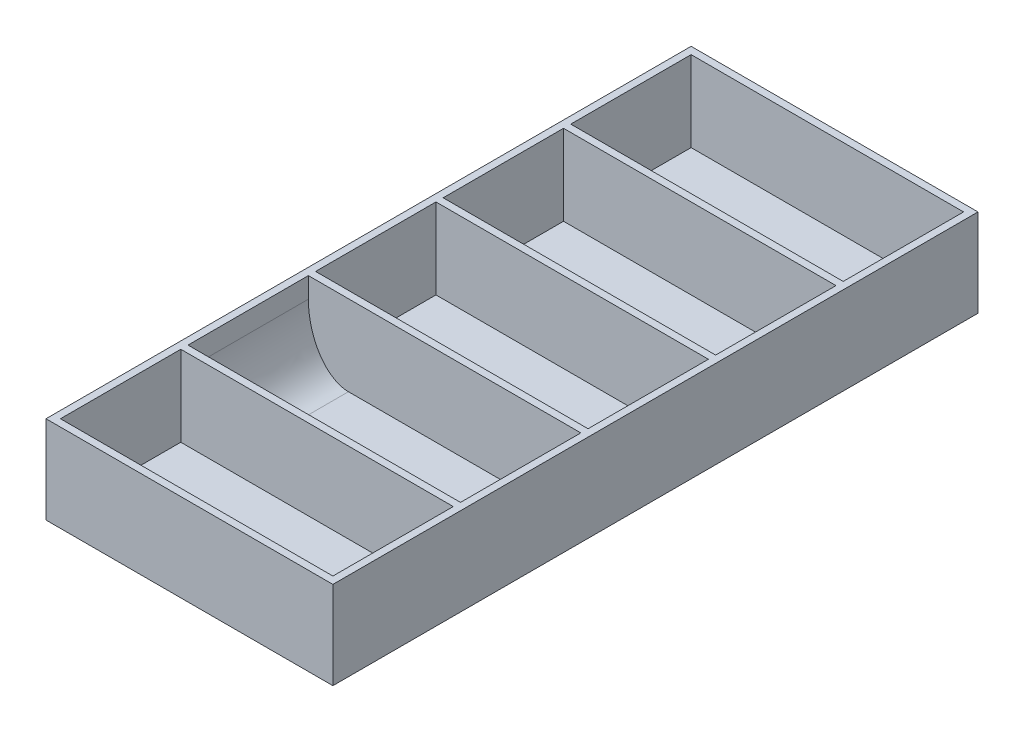
ISO-10303-21;
HEADER;
FILE_DESCRIPTION(('STEP AP214'),'2;1');
FILE_NAME('part.step','',(''),(''),'','','');
FILE_SCHEMA(('AUTOMOTIVE_DESIGN { 1 0 10303 214 1 1 1 1 }'));
ENDSEC;
DATA;
#1=APPLICATION_CONTEXT('core data for automotive mechanical design processes');
#2=APPLICATION_PROTOCOL_DEFINITION('international standard','automotive_design',2000,#1);
#3=PRODUCT_CONTEXT('',#1,'mechanical');
#4=PRODUCT('Part','Part','',(#3));
#5=PRODUCT_RELATED_PRODUCT_CATEGORY('part','',(#4));
#6=PRODUCT_DEFINITION_FORMATION('','',#4);
#7=PRODUCT_DEFINITION_CONTEXT('part definition',#1,'design');
#8=PRODUCT_DEFINITION('design','',#6,#7);
#9=PRODUCT_DEFINITION_SHAPE('','',#8);
#10=(LENGTH_UNIT() NAMED_UNIT(*) SI_UNIT(.MILLI.,.METRE.));
#11=(NAMED_UNIT(*) PLANE_ANGLE_UNIT() SI_UNIT($,.RADIAN.));
#12=(NAMED_UNIT(*) SI_UNIT($,.STERADIAN.) SOLID_ANGLE_UNIT());
#13=UNCERTAINTY_MEASURE_WITH_UNIT(LENGTH_MEASURE(1.E-05),#10,'distance_accuracy_value','');
#14=(GEOMETRIC_REPRESENTATION_CONTEXT(3) GLOBAL_UNCERTAINTY_ASSIGNED_CONTEXT((#13)) GLOBAL_UNIT_ASSIGNED_CONTEXT((#10,
#11,#12)) REPRESENTATION_CONTEXT('',''));
#15=CARTESIAN_POINT('',(0.,0.,0.));
#16=DIRECTION('',(0.,0.,1.));
#17=DIRECTION('',(1.,0.,0.));
#18=AXIS2_PLACEMENT_3D('',#15,#16,#17);
#19=CARTESIAN_POINT('',(69.8,15.,-66.684));
#20=CARTESIAN_POINT('',(69.8,15.,-54.6679999999999));
#21=CARTESIAN_POINT('',(69.8,15.,-42.6520000000001));
#22=CARTESIAN_POINT('',(69.8,15.,-30.636));
#23=CARTESIAN_POINT('',(69.8,0.,-66.684));
#24=CARTESIAN_POINT('',(69.8,0.,-54.6679999999999));
#25=CARTESIAN_POINT('',(69.8,0.,-42.6520000000001));
#26=CARTESIAN_POINT('',(69.8,0.,-30.636));
#27=CARTESIAN_POINT('',(59.8,0.,-66.684));
#28=CARTESIAN_POINT('',(59.8,0.,-54.6679999999999));
#29=CARTESIAN_POINT('',(59.8,0.,-42.6520000000001));
#30=CARTESIAN_POINT('',(59.8,0.,-30.636));
#31=(BOUNDED_SURFACE() B_SPLINE_SURFACE(2,3,((#19,#20,#21,#22),(#23,#24,#25,#26),(#27,#28,#29,
#30)),.UNSPECIFIED.,.F.,.F.,.F.) B_SPLINE_SURFACE_WITH_KNOTS((3,3),(4,4),(0.,1.),(-0.066684,
-0.030636),.UNSPECIFIED.) GEOMETRIC_REPRESENTATION_ITEM() RATIONAL_B_SPLINE_SURFACE(((1.,1.,1.,
1.),(0.707106781186548,0.707106781186548,0.707106781186548,0.707106781186548),(1.,1.,1.,1.))) REPRESENTATION_ITEM('') SURFACE());
#32=CARTESIAN_POINT('',(59.8,0.,-66.684));
#33=CARTESIAN_POINT('',(59.8,0.,-54.6679999999999));
#34=CARTESIAN_POINT('',(59.8,0.,-42.6520000000001));
#35=CARTESIAN_POINT('',(59.8,0.,-30.636));
#36=(BOUNDED_CURVE() B_SPLINE_CURVE(3,(#32,#33,#34,#35),.UNSPECIFIED.,.F.,
.F.) B_SPLINE_CURVE_WITH_KNOTS((4,4),(-0.066684,-0.030636),
.UNSPECIFIED.) CURVE() GEOMETRIC_REPRESENTATION_ITEM() RATIONAL_B_SPLINE_CURVE((1.,1.,1.,1.)) REPRESENTATION_ITEM(''));
#37=CARTESIAN_POINT('',(59.8,0.,-33.64));
#38=VERTEX_POINT('',#37);
#39=CARTESIAN_POINT('',(59.8,0.,-63.68));
#40=VERTEX_POINT('',#39);
#41=EDGE_CURVE('E761',#38,#40,#36,.F.);
#42=CARTESIAN_POINT('',(59.8,0.,-33.64));
#43=CARTESIAN_POINT('',(69.8,0.,-33.64));
#44=CARTESIAN_POINT('',(69.8,15.,-33.64));
#45=(BOUNDED_CURVE() B_SPLINE_CURVE(2,(#42,#43,#44),.UNSPECIFIED.,.F.,
.F.) B_SPLINE_CURVE_WITH_KNOTS((3,3),(0.,1.),
.UNSPECIFIED.) CURVE() GEOMETRIC_REPRESENTATION_ITEM() RATIONAL_B_SPLINE_CURVE((1.,
0.707106781186548,1.)) REPRESENTATION_ITEM(''));
#46=CARTESIAN_POINT('',(69.8,15.,-33.64));
#47=VERTEX_POINT('',#46);
#48=EDGE_CURVE('E60',#47,#38,#45,.F.);
#49=CARTESIAN_POINT('',(69.8,15.,-30.636));
#50=CARTESIAN_POINT('',(69.8,15.,-42.6520000000001));
#51=CARTESIAN_POINT('',(69.8,15.,-54.6679999999999));
#52=CARTESIAN_POINT('',(69.8,15.,-66.684));
#53=(BOUNDED_CURVE() B_SPLINE_CURVE(3,(#49,#50,#51,#52),.UNSPECIFIED.,.F.,
.F.) B_SPLINE_CURVE_WITH_KNOTS((4,4),(-0.066684,-0.030636),
.UNSPECIFIED.) CURVE() GEOMETRIC_REPRESENTATION_ITEM() RATIONAL_B_SPLINE_CURVE((1.,1.,1.,1.)) REPRESENTATION_ITEM(''));
#54=CARTESIAN_POINT('',(69.8,15.,-63.68));
#55=VERTEX_POINT('',#54);
#56=EDGE_CURVE('E803',#55,#47,#53,.F.);
#57=CARTESIAN_POINT('',(69.8,15.,-63.68));
#58=CARTESIAN_POINT('',(69.8,0.,-63.68));
#59=CARTESIAN_POINT('',(59.8,0.,-63.68));
#60=(BOUNDED_CURVE() B_SPLINE_CURVE(2,(#57,#58,#59),.UNSPECIFIED.,.F.,
.F.) B_SPLINE_CURVE_WITH_KNOTS((3,3),(0.,1.),
.UNSPECIFIED.) CURVE() GEOMETRIC_REPRESENTATION_ITEM() RATIONAL_B_SPLINE_CURVE((1.,
0.707106781186548,1.)) REPRESENTATION_ITEM(''));
#61=EDGE_CURVE('E12',#40,#55,#60,.F.);
#62=ORIENTED_EDGE('',*,*,#41,.F.);
#63=ORIENTED_EDGE('',*,*,#48,.F.);
#64=ORIENTED_EDGE('',*,*,#56,.F.);
#65=ORIENTED_EDGE('',*,*,#61,.F.);
#66=EDGE_LOOP('',(#62,#63,#64,#65));
#67=FACE_BOUND('',#66,.T.);
#68=ADVANCED_FACE('F46',(#67),#31,.T.);
#69=CARTESIAN_POINT('',(11.8,0.,-66.684));
#70=CARTESIAN_POINT('',(11.8,0.,-54.668));
#71=CARTESIAN_POINT('',(11.8,0.,-42.652));
#72=CARTESIAN_POINT('',(11.8,0.,-30.636));
#73=CARTESIAN_POINT('',(1.80000000000001,0.,-66.684));
#74=CARTESIAN_POINT('',(1.79999999996875,0.,-54.668));
#75=CARTESIAN_POINT('',(1.79999999996875,0.,-42.652));
#76=CARTESIAN_POINT('',(1.80000000000002,0.,-30.636));
#77=CARTESIAN_POINT('',(1.80000000000001,15.,-66.684));
#78=CARTESIAN_POINT('',(1.80000000000001,15.,-54.668));
#79=CARTESIAN_POINT('',(1.80000000000001,15.,-42.652));
#80=CARTESIAN_POINT('',(1.80000000000002,15.,-30.636));
#81=(BOUNDED_SURFACE() B_SPLINE_SURFACE(2,3,((#69,#70,#71,#72),(#73,#74,#75,#76),(#77,#78,#79,
#80)),.UNSPECIFIED.,.F.,.F.,.F.) B_SPLINE_SURFACE_WITH_KNOTS((3,3),(4,4),(0.,1.),(-0.003004,
0.033044),.UNSPECIFIED.) GEOMETRIC_REPRESENTATION_ITEM() RATIONAL_B_SPLINE_SURFACE(((1.,1.,1.,
1.),(0.707106781186548,0.707106781186548,0.707106781186548,0.707106781186548),(1.,1.,1.,1.))) REPRESENTATION_ITEM('') SURFACE());
#82=CARTESIAN_POINT('',(1.80000000000001,15.,-66.684));
#83=CARTESIAN_POINT('',(1.80000000000001,15.,-54.668));
#84=CARTESIAN_POINT('',(1.80000000000001,15.,-42.652));
#85=CARTESIAN_POINT('',(1.80000000000002,15.,-30.636));
#86=(BOUNDED_CURVE() B_SPLINE_CURVE(3,(#82,#83,#84,#85),.UNSPECIFIED.,.F.,
.F.) B_SPLINE_CURVE_WITH_KNOTS((4,4),(-0.003004,0.033044),
.UNSPECIFIED.) CURVE() GEOMETRIC_REPRESENTATION_ITEM() RATIONAL_B_SPLINE_CURVE((1.,1.,1.,1.)) REPRESENTATION_ITEM(''));
#87=CARTESIAN_POINT('',(1.80000000000001,15.,-33.64));
#88=VERTEX_POINT('',#87);
#89=CARTESIAN_POINT('',(1.80000000000001,15.,-63.68));
#90=VERTEX_POINT('',#89);
#91=EDGE_CURVE('E498',#88,#90,#86,.F.);
#92=CARTESIAN_POINT('',(1.80000000000002,15.,-33.64));
#93=CARTESIAN_POINT('',(1.79999999999285,0.,-33.64));
#94=CARTESIAN_POINT('',(11.8,0.,-33.64));
#95=(BOUNDED_CURVE() B_SPLINE_CURVE(2,(#92,#93,#94),.UNSPECIFIED.,.F.,
.F.) B_SPLINE_CURVE_WITH_KNOTS((3,3),(0.,1.),
.UNSPECIFIED.) CURVE() GEOMETRIC_REPRESENTATION_ITEM() RATIONAL_B_SPLINE_CURVE((1.,
0.707106781186548,1.)) REPRESENTATION_ITEM(''));
#96=CARTESIAN_POINT('',(11.8,0.,-33.64));
#97=VERTEX_POINT('',#96);
#98=EDGE_CURVE('E436',#97,#88,#95,.F.);
#99=CARTESIAN_POINT('',(11.8,0.,-30.636));
#100=CARTESIAN_POINT('',(11.8,0.,-42.652));
#101=CARTESIAN_POINT('',(11.8,0.,-54.668));
#102=CARTESIAN_POINT('',(11.8,0.,-66.684));
#103=(BOUNDED_CURVE() B_SPLINE_CURVE(3,(#99,#100,#101,#102),.UNSPECIFIED.,.F.,
.F.) B_SPLINE_CURVE_WITH_KNOTS((4,4),(-0.003004,0.033044),
.UNSPECIFIED.) CURVE() GEOMETRIC_REPRESENTATION_ITEM() RATIONAL_B_SPLINE_CURVE((1.,1.,1.,1.)) REPRESENTATION_ITEM(''));
#104=CARTESIAN_POINT('',(11.8,0.,-63.68));
#105=VERTEX_POINT('',#104);
#106=EDGE_CURVE('E800',#105,#97,#103,.F.);
#107=CARTESIAN_POINT('',(11.8,0.,-63.68));
#108=CARTESIAN_POINT('',(1.79999999999285,0.,-63.68));
#109=CARTESIAN_POINT('',(1.80000000000001,15.,-63.68));
#110=(BOUNDED_CURVE() B_SPLINE_CURVE(2,(#107,#108,#109),.UNSPECIFIED.,.F.,
.F.) B_SPLINE_CURVE_WITH_KNOTS((3,3),(0.,1.),
.UNSPECIFIED.) CURVE() GEOMETRIC_REPRESENTATION_ITEM() RATIONAL_B_SPLINE_CURVE((1.,
0.707106781186548,1.)) REPRESENTATION_ITEM(''));
#111=EDGE_CURVE('E805',#90,#105,#110,.F.);
#112=ORIENTED_EDGE('',*,*,#91,.F.);
#113=ORIENTED_EDGE('',*,*,#98,.F.);
#114=ORIENTED_EDGE('',*,*,#106,.F.);
#115=ORIENTED_EDGE('',*,*,#111,.F.);
#116=EDGE_LOOP('',(#112,#113,#114,#115));
#117=FACE_BOUND('',#116,.T.);
#118=ADVANCED_FACE('F506',(#117),#81,.T.);
#119=CARTESIAN_POINT('',(54.8,0.,-62.476));
#120=CARTESIAN_POINT('',(54.8,0.,-74.492));
#121=CARTESIAN_POINT('',(54.8,0.,-86.508));
#122=CARTESIAN_POINT('',(54.8,0.,-98.524));
#123=CARTESIAN_POINT('',(69.8,0.,-62.476));
#124=CARTESIAN_POINT('',(69.8,-6.25229035210936E-11,-74.492));
#125=CARTESIAN_POINT('',(69.8,-6.25229035228294E-11,-86.508));
#126=CARTESIAN_POINT('',(69.8,0.,-98.524));
#127=CARTESIAN_POINT('',(69.8,20.,-62.476));
#128=CARTESIAN_POINT('',(69.8,20.,-74.492));
#129=CARTESIAN_POINT('',(69.8,20.,-86.508));
#130=CARTESIAN_POINT('',(69.8,20.,-98.524));
#131=(BOUNDED_SURFACE() B_SPLINE_SURFACE(2,3,((#119,#120,#121,#122),(#123,#124,#125,#126),(#127,
#128,#129,#130)),.UNSPECIFIED.,.F.,.F.,.F.) B_SPLINE_SURFACE_WITH_KNOTS((3,3),(4,4),(0.,1.),
(-0.033044,0.003004),
.UNSPECIFIED.) GEOMETRIC_REPRESENTATION_ITEM() RATIONAL_B_SPLINE_SURFACE(((1.,1.,1.,1.),
(0.707106781186548,0.707106781186548,0.707106781186548,0.707106781186548),(1.,1.,1.,1.))) REPRESENTATION_ITEM('') SURFACE());
#132=CARTESIAN_POINT('',(69.8,20.,-62.476));
#133=CARTESIAN_POINT('',(69.8,20.,-74.492));
#134=CARTESIAN_POINT('',(69.8,20.,-86.508));
#135=CARTESIAN_POINT('',(69.8,20.,-98.524));
#136=(BOUNDED_CURVE() B_SPLINE_CURVE(3,(#132,#133,#134,#135),.UNSPECIFIED.,.F.,
.F.) B_SPLINE_CURVE_WITH_KNOTS((4,4),(-0.033044,0.003004),
.UNSPECIFIED.) CURVE() GEOMETRIC_REPRESENTATION_ITEM() RATIONAL_B_SPLINE_CURVE((1.,1.,1.,1.)) REPRESENTATION_ITEM(''));
#137=CARTESIAN_POINT('',(69.8,20.,-95.52));
#138=VERTEX_POINT('',#137);
#139=CARTESIAN_POINT('',(69.8,20.,-65.48));
#140=VERTEX_POINT('',#139);
#141=EDGE_CURVE('E680',#138,#140,#136,.F.);
#142=CARTESIAN_POINT('',(69.8,20.,-95.52));
#143=CARTESIAN_POINT('',(69.8,-1.43201422945389E-11,-95.52));
#144=CARTESIAN_POINT('',(54.8,0.,-95.52));
#145=(BOUNDED_CURVE() B_SPLINE_CURVE(2,(#142,#143,#144),.UNSPECIFIED.,.F.,
.F.) B_SPLINE_CURVE_WITH_KNOTS((3,3),(0.,1.),
.UNSPECIFIED.) CURVE() GEOMETRIC_REPRESENTATION_ITEM() RATIONAL_B_SPLINE_CURVE((1.,
0.707106781186548,1.)) REPRESENTATION_ITEM(''));
#146=CARTESIAN_POINT('',(54.8,0.,-95.52));
#147=VERTEX_POINT('',#146);
#148=EDGE_CURVE('E813',#147,#138,#145,.F.);
#149=CARTESIAN_POINT('',(54.8,0.,-98.524));
#150=CARTESIAN_POINT('',(54.8,0.,-86.508));
#151=CARTESIAN_POINT('',(54.8,0.,-74.492));
#152=CARTESIAN_POINT('',(54.8,0.,-62.476));
#153=(BOUNDED_CURVE() B_SPLINE_CURVE(3,(#149,#150,#151,#152),.UNSPECIFIED.,.F.,
.F.) B_SPLINE_CURVE_WITH_KNOTS((4,4),(-0.033044,0.003004),
.UNSPECIFIED.) CURVE() GEOMETRIC_REPRESENTATION_ITEM() RATIONAL_B_SPLINE_CURVE((1.,1.,1.,1.)) REPRESENTATION_ITEM(''));
#154=CARTESIAN_POINT('',(54.8,0.,-65.48));
#155=VERTEX_POINT('',#154);
#156=EDGE_CURVE('E390',#155,#147,#153,.F.);
#157=CARTESIAN_POINT('',(54.8,0.,-65.48));
#158=CARTESIAN_POINT('',(69.8,-1.43201422942072E-11,-65.48));
#159=CARTESIAN_POINT('',(69.8,20.,-65.48));
#160=(BOUNDED_CURVE() B_SPLINE_CURVE(2,(#157,#158,#159),.UNSPECIFIED.,.F.,
.F.) B_SPLINE_CURVE_WITH_KNOTS((3,3),(0.,1.),
.UNSPECIFIED.) CURVE() GEOMETRIC_REPRESENTATION_ITEM() RATIONAL_B_SPLINE_CURVE((1.,
0.707106781186548,1.)) REPRESENTATION_ITEM(''));
#161=EDGE_CURVE('E811',#140,#155,#160,.F.);
#162=ORIENTED_EDGE('',*,*,#141,.F.);
#163=ORIENTED_EDGE('',*,*,#148,.F.);
#164=ORIENTED_EDGE('',*,*,#156,.F.);
#165=ORIENTED_EDGE('',*,*,#161,.F.);
#166=EDGE_LOOP('',(#162,#163,#164,#165));
#167=FACE_BOUND('',#166,.T.);
#168=ADVANCED_FACE('F520',(#167),#131,.T.);
#169=CARTESIAN_POINT('',(54.8,15.,-97.32));
#170=DIRECTION('',(0.,0.,-1.));
#171=DIRECTION('',(-1.,0.,0.));
#172=AXIS2_PLACEMENT_3D('',#169,#170,#171);
#173=CYLINDRICAL_SURFACE('',#172,15.);
#174=DIRECTION('',(0.,0.,1.));
#175=VECTOR('',#174,1.);
#176=CARTESIAN_POINT('',(69.8,15.,-97.32));
#177=LINE('',#176,#175);
#178=CARTESIAN_POINT('',(69.8,15.,-127.36));
#179=VERTEX_POINT('',#178);
#180=CARTESIAN_POINT('',(69.8,15.,-97.32));
#181=VERTEX_POINT('',#180);
#182=EDGE_CURVE('E660',#179,#181,#177,.T.);
#183=ORIENTED_EDGE('',*,*,#182,.F.);
#184=CARTESIAN_POINT('',(54.8,15.,-127.36));
#185=DIRECTION('',(0.,0.,1.));
#186=DIRECTION('',(1.,0.,0.));
#187=AXIS2_PLACEMENT_3D('',#184,#185,#186);
#188=CIRCLE('',#187,15.);
#189=CARTESIAN_POINT('',(54.8,0.,-127.36));
#190=VERTEX_POINT('',#189);
#191=EDGE_CURVE('E674',#190,#179,#188,.T.);
#192=ORIENTED_EDGE('',*,*,#191,.F.);
#193=DIRECTION('',(0.,0.,1.));
#194=VECTOR('',#193,1.);
#195=CARTESIAN_POINT('',(54.8,0.,-97.32));
#196=LINE('',#195,#194);
#197=CARTESIAN_POINT('',(54.8,0.,-97.32));
#198=VERTEX_POINT('',#197);
#199=EDGE_CURVE('E669',#198,#190,#196,.F.);
#200=ORIENTED_EDGE('',*,*,#199,.F.);
#201=CARTESIAN_POINT('',(54.8,15.,-97.32));
#202=DIRECTION('',(0.,0.,-1.));
#203=DIRECTION('',(-1.,0.,0.));
#204=AXIS2_PLACEMENT_3D('',#201,#202,#203);
#205=CIRCLE('',#204,15.);
#206=EDGE_CURVE('E677',#181,#198,#205,.T.);
#207=ORIENTED_EDGE('',*,*,#206,.F.);
#208=EDGE_LOOP('',(#183,#192,#200,#207));
#209=FACE_BOUND('',#208,.T.);
#210=ADVANCED_FACE('F623',(#209),#173,.F.);
#211=CARTESIAN_POINT('',(59.8,0.,-126.156));
#212=CARTESIAN_POINT('',(59.8,0.,-138.172));
#213=CARTESIAN_POINT('',(59.8,0.,-150.188));
#214=CARTESIAN_POINT('',(59.8,0.,-162.204));
#215=CARTESIAN_POINT('',(69.8,0.,-126.156));
#216=CARTESIAN_POINT('',(69.8,0.,-138.172));
#217=CARTESIAN_POINT('',(69.8,0.,-150.188));
#218=CARTESIAN_POINT('',(69.8,0.,-162.204));
#219=CARTESIAN_POINT('',(69.8,15.,-126.156));
#220=CARTESIAN_POINT('',(69.8,15.,-138.172));
#221=CARTESIAN_POINT('',(69.8,15.,-150.188));
#222=CARTESIAN_POINT('',(69.8,15.,-162.204));
#223=(BOUNDED_SURFACE() B_SPLINE_SURFACE(2,3,((#211,#212,#213,#214),(#215,#216,#217,#218),(#219,
#220,#221,#222)),.UNSPECIFIED.,.F.,.F.,.F.) B_SPLINE_SURFACE_WITH_KNOTS((3,3),(4,4),(0.,1.),
(-0.003004,0.033044),
.UNSPECIFIED.) GEOMETRIC_REPRESENTATION_ITEM() RATIONAL_B_SPLINE_SURFACE(((1.,1.,1.,1.),
(0.707106781186548,0.707106781186548,0.707106781186548,0.707106781186548),(1.,1.,1.,1.))) REPRESENTATION_ITEM('') SURFACE());
#224=CARTESIAN_POINT('',(69.8,15.,-126.156));
#225=CARTESIAN_POINT('',(69.8,15.,-138.172));
#226=CARTESIAN_POINT('',(69.8,15.,-150.188));
#227=CARTESIAN_POINT('',(69.8,15.,-162.204));
#228=(BOUNDED_CURVE() B_SPLINE_CURVE(3,(#224,#225,#226,#227),.UNSPECIFIED.,.F.,
.F.) B_SPLINE_CURVE_WITH_KNOTS((4,4),(-0.003004,0.033044),
.UNSPECIFIED.) CURVE() GEOMETRIC_REPRESENTATION_ITEM() RATIONAL_B_SPLINE_CURVE((1.,1.,1.,1.)) REPRESENTATION_ITEM(''));
#229=CARTESIAN_POINT('',(69.8,15.,-159.2));
#230=VERTEX_POINT('',#229);
#231=CARTESIAN_POINT('',(69.8,15.,-129.16));
#232=VERTEX_POINT('',#231);
#233=EDGE_CURVE('E857',#230,#232,#228,.F.);
#234=CARTESIAN_POINT('',(69.8,15.,-159.2));
#235=CARTESIAN_POINT('',(69.8,0.,-159.2));
#236=CARTESIAN_POINT('',(59.8,0.,-159.2));
#237=(BOUNDED_CURVE() B_SPLINE_CURVE(2,(#234,#235,#236),.UNSPECIFIED.,.F.,
.F.) B_SPLINE_CURVE_WITH_KNOTS((3,3),(0.,1.),
.UNSPECIFIED.) CURVE() GEOMETRIC_REPRESENTATION_ITEM() RATIONAL_B_SPLINE_CURVE((1.,
0.707106781186548,1.)) REPRESENTATION_ITEM(''));
#238=CARTESIAN_POINT('',(59.8,0.,-159.2));
#239=VERTEX_POINT('',#238);
#240=EDGE_CURVE('E263',#239,#230,#237,.F.);
#241=CARTESIAN_POINT('',(59.8,0.,-162.204));
#242=CARTESIAN_POINT('',(59.8,0.,-150.188));
#243=CARTESIAN_POINT('',(59.8,0.,-138.172));
#244=CARTESIAN_POINT('',(59.8,0.,-126.156));
#245=(BOUNDED_CURVE() B_SPLINE_CURVE(3,(#241,#242,#243,#244),.UNSPECIFIED.,.F.,
.F.) B_SPLINE_CURVE_WITH_KNOTS((4,4),(-0.003004,0.033044),
.UNSPECIFIED.) CURVE() GEOMETRIC_REPRESENTATION_ITEM() RATIONAL_B_SPLINE_CURVE((1.,1.,1.,1.)) REPRESENTATION_ITEM(''));
#246=CARTESIAN_POINT('',(59.8,0.,-129.16));
#247=VERTEX_POINT('',#246);
#248=EDGE_CURVE('E854',#247,#239,#245,.F.);
#249=CARTESIAN_POINT('',(59.8,0.,-129.16));
#250=CARTESIAN_POINT('',(69.8,0.,-129.16));
#251=CARTESIAN_POINT('',(69.8,15.,-129.16));
#252=(BOUNDED_CURVE() B_SPLINE_CURVE(2,(#249,#250,#251),.UNSPECIFIED.,.F.,
.F.) B_SPLINE_CURVE_WITH_KNOTS((3,3),(0.,1.),
.UNSPECIFIED.) CURVE() GEOMETRIC_REPRESENTATION_ITEM() RATIONAL_B_SPLINE_CURVE((1.,
0.707106781186548,1.)) REPRESENTATION_ITEM(''));
#253=EDGE_CURVE('E670',#232,#247,#252,.F.);
#254=ORIENTED_EDGE('',*,*,#233,.F.);
#255=ORIENTED_EDGE('',*,*,#240,.F.);
#256=ORIENTED_EDGE('',*,*,#248,.F.);
#257=ORIENTED_EDGE('',*,*,#253,.F.);
#258=EDGE_LOOP('',(#254,#255,#256,#257));
#259=FACE_BOUND('',#258,.T.);
#260=ADVANCED_FACE('F609',(#259),#223,.T.);
#261=CARTESIAN_POINT('',(0.,-1.8,0.));
#262=DIRECTION('',(0.,0.,1.));
#263=DIRECTION('',(1.,0.,0.));
#264=AXIS2_PLACEMENT_3D('',#261,#262,#263);
#265=PLANE('',#264);
#266=DIRECTION('',(0.,1.,0.));
#267=VECTOR('',#266,1.);
#268=CARTESIAN_POINT('',(71.6,-1.8,0.));
#269=LINE('',#268,#267);
#270=CARTESIAN_POINT('',(71.6,-1.8,0.));
#271=VERTEX_POINT('',#270);
#272=CARTESIAN_POINT('',(71.6,20.1,0.));
#273=VERTEX_POINT('',#272);
#274=EDGE_CURVE('E309',#271,#273,#269,.T.);
#275=ORIENTED_EDGE('',*,*,#274,.T.);
#276=DIRECTION('',(1.,0.,0.));
#277=VECTOR('',#276,1.);
#278=CARTESIAN_POINT('',(0.,20.1,0.));
#279=LINE('',#278,#277);
#280=CARTESIAN_POINT('',(0.,20.1,0.));
#281=VERTEX_POINT('',#280);
#282=EDGE_CURVE('E906',#281,#273,#279,.T.);
#283=ORIENTED_EDGE('',*,*,#282,.F.);
#284=DIRECTION('',(0.,1.,0.));
#285=VECTOR('',#284,1.);
#286=CARTESIAN_POINT('',(0.,-1.8,0.));
#287=LINE('',#286,#285);
#288=CARTESIAN_POINT('',(0.,-1.8,0.));
#289=VERTEX_POINT('',#288);
#290=EDGE_CURVE('E860',#289,#281,#287,.T.);
#291=ORIENTED_EDGE('',*,*,#290,.F.);
#292=DIRECTION('',(1.,0.,0.));
#293=VECTOR('',#292,1.);
#294=CARTESIAN_POINT('',(0.,-1.8,0.));
#295=LINE('',#294,#293);
#296=EDGE_CURVE('E894',#289,#271,#295,.T.);
#297=ORIENTED_EDGE('',*,*,#296,.T.);
#298=EDGE_LOOP('',(#275,#283,#291,#297));
#299=FACE_BOUND('',#298,.T.);
#300=ADVANCED_FACE('F622',(#299),#265,.T.);
#301=CARTESIAN_POINT('',(0.,-1.8,0.));
#302=DIRECTION('',(1.,0.,0.));
#303=DIRECTION('',(0.,0.,-1.));
#304=AXIS2_PLACEMENT_3D('',#301,#302,#303);
#305=PLANE('',#304);
#306=ORIENTED_EDGE('',*,*,#290,.T.);
#307=DIRECTION('',(0.,0.,1.));
#308=VECTOR('',#307,1.);
#309=CARTESIAN_POINT('',(0.,20.1,0.));
#310=LINE('',#309,#308);
#311=CARTESIAN_POINT('',(0.,20.1,-161.));
#312=VERTEX_POINT('',#311);
#313=EDGE_CURVE('E909',#312,#281,#310,.T.);
#314=ORIENTED_EDGE('',*,*,#313,.F.);
#315=DIRECTION('',(0.,1.,0.));
#316=VECTOR('',#315,1.);
#317=CARTESIAN_POINT('',(0.,-1.8,-161.));
#318=LINE('',#317,#316);
#319=CARTESIAN_POINT('',(0.,-1.8,-161.));
#320=VERTEX_POINT('',#319);
#321=EDGE_CURVE('E862',#320,#312,#318,.T.);
#322=ORIENTED_EDGE('',*,*,#321,.F.);
#323=DIRECTION('',(0.,0.,-1.));
#324=VECTOR('',#323,1.);
#325=CARTESIAN_POINT('',(0.,-1.8,0.));
#326=LINE('',#325,#324);
#327=EDGE_CURVE('E872',#289,#320,#326,.T.);
#328=ORIENTED_EDGE('',*,*,#327,.F.);
#329=EDGE_LOOP('',(#306,#314,#322,#328));
#330=FACE_BOUND('',#329,.T.);
#331=ADVANCED_FACE('F413',(#330),#305,.F.);
#332=CARTESIAN_POINT('',(0.,-1.8,-161.));
#333=DIRECTION('',(0.,0.,1.));
#334=DIRECTION('',(1.,0.,0.));
#335=AXIS2_PLACEMENT_3D('',#332,#333,#334);
#336=PLANE('',#335);
#337=ORIENTED_EDGE('',*,*,#321,.T.);
#338=DIRECTION('',(-1.,0.,0.));
#339=VECTOR('',#338,1.);
#340=CARTESIAN_POINT('',(0.,20.1,-161.));
#341=LINE('',#340,#339);
#342=CARTESIAN_POINT('',(71.6,20.1,-161.));
#343=VERTEX_POINT('',#342);
#344=EDGE_CURVE('E899',#343,#312,#341,.T.);
#345=ORIENTED_EDGE('',*,*,#344,.F.);
#346=DIRECTION('',(0.,1.,0.));
#347=VECTOR('',#346,1.);
#348=CARTESIAN_POINT('',(71.6,-1.8,-161.));
#349=LINE('',#348,#347);
#350=CARTESIAN_POINT('',(71.6,-1.8,-161.));
#351=VERTEX_POINT('',#350);
#352=EDGE_CURVE('E869',#351,#343,#349,.T.);
#353=ORIENTED_EDGE('',*,*,#352,.F.);
#354=DIRECTION('',(1.,0.,0.));
#355=VECTOR('',#354,1.);
#356=CARTESIAN_POINT('',(0.,-1.8,-161.));
#357=LINE('',#356,#355);
#358=EDGE_CURVE('E885',#320,#351,#357,.T.);
#359=ORIENTED_EDGE('',*,*,#358,.F.);
#360=EDGE_LOOP('',(#337,#345,#353,#359));
#361=FACE_BOUND('',#360,.T.);
#362=ADVANCED_FACE('F1001',(#361),#336,.F.);
#363=CARTESIAN_POINT('',(71.6,-1.8,0.));
#364=DIRECTION('',(1.,0.,0.));
#365=DIRECTION('',(0.,0.,-1.));
#366=AXIS2_PLACEMENT_3D('',#363,#364,#365);
#367=PLANE('',#366);
#368=ORIENTED_EDGE('',*,*,#352,.T.);
#369=DIRECTION('',(0.,0.,-1.));
#370=VECTOR('',#369,1.);
#371=CARTESIAN_POINT('',(71.6,20.1,0.));
#372=LINE('',#371,#370);
#373=EDGE_CURVE('E903',#273,#343,#372,.T.);
#374=ORIENTED_EDGE('',*,*,#373,.F.);
#375=ORIENTED_EDGE('',*,*,#274,.F.);
#376=DIRECTION('',(0.,0.,-1.));
#377=VECTOR('',#376,1.);
#378=CARTESIAN_POINT('',(71.6,-1.8,0.));
#379=LINE('',#378,#377);
#380=EDGE_CURVE('E890',#271,#351,#379,.T.);
#381=ORIENTED_EDGE('',*,*,#380,.T.);
#382=EDGE_LOOP('',(#368,#374,#375,#381));
#383=FACE_BOUND('',#382,.T.);
#384=ADVANCED_FACE('F1007',(#383),#367,.T.);
#385=CARTESIAN_POINT('',(0.,-1.8,0.));
#386=DIRECTION('',(0.,1.,0.));
#387=DIRECTION('',(0.,0.,1.));
#388=AXIS2_PLACEMENT_3D('',#385,#386,#387);
#389=PLANE('',#388);
#390=ORIENTED_EDGE('',*,*,#296,.F.);
#391=ORIENTED_EDGE('',*,*,#327,.T.);
#392=ORIENTED_EDGE('',*,*,#358,.T.);
#393=ORIENTED_EDGE('',*,*,#380,.F.);
#394=EDGE_LOOP('',(#390,#391,#392,#393));
#395=FACE_BOUND('',#394,.T.);
#396=ADVANCED_FACE('F411',(#395),#389,.F.);
#397=CARTESIAN_POINT('',(0.,20.1,0.));
#398=DIRECTION('',(0.,-1.,0.));
#399=DIRECTION('',(0.,0.,-1.));
#400=AXIS2_PLACEMENT_3D('',#397,#398,#399);
#401=PLANE('',#400);
#402=DIRECTION('',(0.,0.,-1.));
#403=VECTOR('',#402,1.);
#404=CARTESIAN_POINT('',(69.8,20.1,-97.32));
#405=LINE('',#404,#403);
#406=CARTESIAN_POINT('',(69.8,20.1,-97.32));
#407=VERTEX_POINT('',#406);
#408=CARTESIAN_POINT('',(69.8,20.1,-127.36));
#409=VERTEX_POINT('',#408);
#410=EDGE_CURVE('E314',#407,#409,#405,.T.);
#411=ORIENTED_EDGE('',*,*,#410,.F.);
#412=DIRECTION('',(1.,0.,0.));
#413=VECTOR('',#412,1.);
#414=CARTESIAN_POINT('',(69.8,20.1,-97.32));
#415=LINE('',#414,#413);
#416=CARTESIAN_POINT('',(1.8,20.1,-97.32));
#417=VERTEX_POINT('',#416);
#418=EDGE_CURVE('E325',#417,#407,#415,.T.);
#419=ORIENTED_EDGE('',*,*,#418,.F.);
#420=DIRECTION('',(0.,0.,1.));
#421=VECTOR('',#420,1.);
#422=CARTESIAN_POINT('',(1.8,20.1,-97.32));
#423=LINE('',#422,#421);
#424=CARTESIAN_POINT('',(1.8,20.1,-127.36));
#425=VERTEX_POINT('',#424);
#426=EDGE_CURVE('E321',#425,#417,#423,.T.);
#427=ORIENTED_EDGE('',*,*,#426,.F.);
#428=DIRECTION('',(-1.,0.,0.));
#429=VECTOR('',#428,1.);
#430=CARTESIAN_POINT('',(69.8,20.1,-127.36));
#431=LINE('',#430,#429);
#432=EDGE_CURVE('E317',#409,#425,#431,.T.);
#433=ORIENTED_EDGE('',*,*,#432,.F.);
#434=EDGE_LOOP('',(#411,#419,#427,#433));
#435=FACE_BOUND('',#434,.T.);
#436=DIRECTION('',(0.,0.,1.));
#437=VECTOR('',#436,1.);
#438=CARTESIAN_POINT('',(1.8,20.1,-31.84));
#439=LINE('',#438,#437);
#440=CARTESIAN_POINT('',(1.8,20.1,-31.84));
#441=VERTEX_POINT('',#440);
#442=CARTESIAN_POINT('',(1.80000000000001,20.1,-1.8));
#443=VERTEX_POINT('',#442);
#444=EDGE_CURVE('E696',#441,#443,#439,.T.);
#445=ORIENTED_EDGE('',*,*,#444,.F.);
#446=DIRECTION('',(-1.,0.,0.));
#447=VECTOR('',#446,1.);
#448=CARTESIAN_POINT('',(1.8,20.1,-31.84));
#449=LINE('',#448,#447);
#450=CARTESIAN_POINT('',(69.8,20.1,-31.84));
#451=VERTEX_POINT('',#450);
#452=EDGE_CURVE('E707',#451,#441,#449,.T.);
#453=ORIENTED_EDGE('',*,*,#452,.F.);
#454=DIRECTION('',(0.,0.,-1.));
#455=VECTOR('',#454,1.);
#456=CARTESIAN_POINT('',(69.8,20.1,-31.84));
#457=LINE('',#456,#455);
#458=CARTESIAN_POINT('',(69.8,20.1,-1.8));
#459=VERTEX_POINT('',#458);
#460=EDGE_CURVE('E703',#459,#451,#457,.T.);
#461=ORIENTED_EDGE('',*,*,#460,.F.);
#462=DIRECTION('',(1.,0.,0.));
#463=VECTOR('',#462,1.);
#464=CARTESIAN_POINT('',(1.80000000000001,20.1,-1.8));
#465=LINE('',#464,#463);
#466=EDGE_CURVE('E699',#443,#459,#465,.T.);
#467=ORIENTED_EDGE('',*,*,#466,.F.);
#468=EDGE_LOOP('',(#445,#453,#461,#467));
#469=FACE_BOUND('',#468,.T.);
#470=ORIENTED_EDGE('',*,*,#313,.T.);
#471=ORIENTED_EDGE('',*,*,#282,.T.);
#472=ORIENTED_EDGE('',*,*,#373,.T.);
#473=ORIENTED_EDGE('',*,*,#344,.T.);
#474=EDGE_LOOP('',(#470,#471,#472,#473));
#475=FACE_BOUND('',#474,.T.);
#476=DIRECTION('',(0.,0.,-1.));
#477=VECTOR('',#476,1.);
#478=CARTESIAN_POINT('',(69.8,20.1,-63.68));
#479=LINE('',#478,#477);
#480=CARTESIAN_POINT('',(69.8,20.1,-33.64));
#481=VERTEX_POINT('',#480);
#482=CARTESIAN_POINT('',(69.8,20.1,-63.68));
#483=VERTEX_POINT('',#482);
#484=EDGE_CURVE('E737',#481,#483,#479,.T.);
#485=ORIENTED_EDGE('',*,*,#484,.F.);
#486=DIRECTION('',(1.,0.,0.));
#487=VECTOR('',#486,1.);
#488=CARTESIAN_POINT('',(69.8,20.1,-33.64));
#489=LINE('',#488,#487);
#490=CARTESIAN_POINT('',(1.80000000000001,20.1,-33.64));
#491=VERTEX_POINT('',#490);
#492=EDGE_CURVE('E748',#491,#481,#489,.T.);
#493=ORIENTED_EDGE('',*,*,#492,.F.);
#494=DIRECTION('',(0.,0.,1.));
#495=VECTOR('',#494,1.);
#496=CARTESIAN_POINT('',(1.80000000000001,20.1,-63.68));
#497=LINE('',#496,#495);
#498=CARTESIAN_POINT('',(1.80000000000001,20.1,-63.68));
#499=VERTEX_POINT('',#498);
#500=EDGE_CURVE('E744',#499,#491,#497,.T.);
#501=ORIENTED_EDGE('',*,*,#500,.F.);
#502=DIRECTION('',(-1.,0.,0.));
#503=VECTOR('',#502,1.);
#504=CARTESIAN_POINT('',(69.8,20.1,-63.68));
#505=LINE('',#504,#503);
#506=EDGE_CURVE('E740',#483,#499,#505,.T.);
#507=ORIENTED_EDGE('',*,*,#506,.F.);
#508=EDGE_LOOP('',(#485,#493,#501,#507));
#509=FACE_BOUND('',#508,.T.);
#510=DIRECTION('',(0.,0.,1.));
#511=VECTOR('',#510,1.);
#512=CARTESIAN_POINT('',(1.79999999999999,20.1,-95.52));
#513=LINE('',#512,#511);
#514=CARTESIAN_POINT('',(1.79999999999999,20.1,-95.52));
#515=VERTEX_POINT('',#514);
#516=CARTESIAN_POINT('',(1.8,20.1,-65.48));
#517=VERTEX_POINT('',#516);
#518=EDGE_CURVE('E353',#515,#517,#513,.T.);
#519=ORIENTED_EDGE('',*,*,#518,.F.);
#520=DIRECTION('',(-1.,0.,0.));
#521=VECTOR('',#520,1.);
#522=CARTESIAN_POINT('',(1.79999999999999,20.1,-95.52));
#523=LINE('',#522,#521);
#524=CARTESIAN_POINT('',(69.8,20.1,-95.52));
#525=VERTEX_POINT('',#524);
#526=EDGE_CURVE('E364',#525,#515,#523,.T.);
#527=ORIENTED_EDGE('',*,*,#526,.F.);
#528=DIRECTION('',(0.,0.,-1.));
#529=VECTOR('',#528,1.);
#530=CARTESIAN_POINT('',(69.8,20.1,-95.52));
#531=LINE('',#530,#529);
#532=CARTESIAN_POINT('',(69.8,20.1,-65.48));
#533=VERTEX_POINT('',#532);
#534=EDGE_CURVE('E360',#533,#525,#531,.T.);
#535=ORIENTED_EDGE('',*,*,#534,.F.);
#536=DIRECTION('',(1.,0.,0.));
#537=VECTOR('',#536,1.);
#538=CARTESIAN_POINT('',(1.8,20.1,-65.48));
#539=LINE('',#538,#537);
#540=EDGE_CURVE('E356',#517,#533,#539,.T.);
#541=ORIENTED_EDGE('',*,*,#540,.F.);
#542=EDGE_LOOP('',(#519,#527,#535,#541));
#543=FACE_BOUND('',#542,.T.);
#544=DIRECTION('',(0.,0.,-1.));
#545=VECTOR('',#544,1.);
#546=CARTESIAN_POINT('',(69.8,20.1,-129.16));
#547=LINE('',#546,#545);
#548=CARTESIAN_POINT('',(69.8,20.1,-129.16));
#549=VERTEX_POINT('',#548);
#550=CARTESIAN_POINT('',(69.8,20.1,-159.2));
#551=VERTEX_POINT('',#550);
#552=EDGE_CURVE('E244',#549,#551,#547,.T.);
#553=ORIENTED_EDGE('',*,*,#552,.F.);
#554=DIRECTION('',(1.,0.,0.));
#555=VECTOR('',#554,1.);
#556=CARTESIAN_POINT('',(69.8,20.1,-129.16));
#557=LINE('',#556,#555);
#558=CARTESIAN_POINT('',(1.8,20.1,-129.16));
#559=VERTEX_POINT('',#558);
#560=EDGE_CURVE('E277',#559,#549,#557,.T.);
#561=ORIENTED_EDGE('',*,*,#560,.F.);
#562=DIRECTION('',(0.,0.,1.));
#563=VECTOR('',#562,1.);
#564=CARTESIAN_POINT('',(1.8,20.1,-129.16));
#565=LINE('',#564,#563);
#566=CARTESIAN_POINT('',(1.79999999999999,20.1,-159.2));
#567=VERTEX_POINT('',#566);
#568=EDGE_CURVE('E273',#567,#559,#565,.T.);
#569=ORIENTED_EDGE('',*,*,#568,.F.);
#570=DIRECTION('',(-1.,0.,0.));
#571=VECTOR('',#570,1.);
#572=CARTESIAN_POINT('',(69.8,20.1,-159.2));
#573=LINE('',#572,#571);
#574=EDGE_CURVE('E255',#551,#567,#573,.T.);
#575=ORIENTED_EDGE('',*,*,#574,.F.);
#576=EDGE_LOOP('',(#553,#561,#569,#575));
#577=FACE_BOUND('',#576,.T.);
#578=ADVANCED_FACE('F271',(#435,#469,#475,#509,#543,#577),#401,.F.);
#579=CARTESIAN_POINT('',(69.8,20.1,-63.68));
#580=DIRECTION('',(-1.,0.,0.));
#581=DIRECTION('',(0.,0.,1.));
#582=AXIS2_PLACEMENT_3D('',#579,#580,#581);
#583=PLANE('',#582);
#584=DIRECTION('',(0.,-1.,0.));
#585=VECTOR('',#584,1.);
#586=CARTESIAN_POINT('',(69.8,20.1,-63.68));
#587=LINE('',#586,#585);
#588=EDGE_CURVE('E774',#483,#55,#587,.T.);
#589=ORIENTED_EDGE('',*,*,#588,.T.);
#590=ORIENTED_EDGE('',*,*,#56,.T.);
#591=DIRECTION('',(0.,-1.,0.));
#592=VECTOR('',#591,1.);
#593=CARTESIAN_POINT('',(69.8,20.1,-33.64));
#594=LINE('',#593,#592);
#595=EDGE_CURVE('E751',#481,#47,#594,.T.);
#596=ORIENTED_EDGE('',*,*,#595,.F.);
#597=ORIENTED_EDGE('',*,*,#484,.T.);
#598=EDGE_LOOP('',(#589,#590,#596,#597));
#599=FACE_BOUND('',#598,.T.);
#600=ADVANCED_FACE('F484',(#599),#583,.T.);
#601=CARTESIAN_POINT('',(69.8,20.1,-63.68));
#602=DIRECTION('',(0.,0.,1.));
#603=DIRECTION('',(1.,0.,0.));
#604=AXIS2_PLACEMENT_3D('',#601,#602,#603);
#605=PLANE('',#604);
#606=DIRECTION('',(-1.,0.,0.));
#607=VECTOR('',#606,1.);
#608=CARTESIAN_POINT('',(69.8,0.,-63.68));
#609=LINE('',#608,#607);
#610=EDGE_CURVE('E736',#40,#105,#609,.T.);
#611=ORIENTED_EDGE('',*,*,#610,.F.);
#612=ORIENTED_EDGE('',*,*,#61,.T.);
#613=ORIENTED_EDGE('',*,*,#588,.F.);
#614=ORIENTED_EDGE('',*,*,#506,.T.);
#615=DIRECTION('',(0.,-1.,0.));
#616=VECTOR('',#615,1.);
#617=CARTESIAN_POINT('',(1.80000000000001,20.1,-63.68));
#618=LINE('',#617,#616);
#619=EDGE_CURVE('E786',#499,#90,#618,.T.);
#620=ORIENTED_EDGE('',*,*,#619,.T.);
#621=ORIENTED_EDGE('',*,*,#111,.T.);
#622=EDGE_LOOP('',(#611,#612,#613,#614,#620,#621));
#623=FACE_BOUND('',#622,.T.);
#624=ADVANCED_FACE('F475',(#623),#605,.T.);
#625=CARTESIAN_POINT('',(1.80000000000001,20.1,-63.68));
#626=DIRECTION('',(1.,0.,0.));
#627=DIRECTION('',(0.,0.,-1.));
#628=AXIS2_PLACEMENT_3D('',#625,#626,#627);
#629=PLANE('',#628);
#630=DIRECTION('',(0.,-1.,0.));
#631=VECTOR('',#630,1.);
#632=CARTESIAN_POINT('',(1.80000000000001,20.1,-33.64));
#633=LINE('',#632,#631);
#634=EDGE_CURVE('E773',#491,#88,#633,.T.);
#635=ORIENTED_EDGE('',*,*,#634,.T.);
#636=ORIENTED_EDGE('',*,*,#91,.T.);
#637=ORIENTED_EDGE('',*,*,#619,.F.);
#638=ORIENTED_EDGE('',*,*,#500,.T.);
#639=EDGE_LOOP('',(#635,#636,#637,#638));
#640=FACE_BOUND('',#639,.T.);
#641=ADVANCED_FACE('F455',(#640),#629,.T.);
#642=CARTESIAN_POINT('',(69.8,20.1,-33.64));
#643=DIRECTION('',(0.,0.,-1.));
#644=DIRECTION('',(-1.,0.,0.));
#645=AXIS2_PLACEMENT_3D('',#642,#643,#644);
#646=PLANE('',#645);
#647=ORIENTED_EDGE('',*,*,#595,.T.);
#648=ORIENTED_EDGE('',*,*,#48,.T.);
#649=DIRECTION('',(1.,0.,0.));
#650=VECTOR('',#649,1.);
#651=CARTESIAN_POINT('',(69.8,0.,-33.64));
#652=LINE('',#651,#650);
#653=EDGE_CURVE('E741',#97,#38,#652,.T.);
#654=ORIENTED_EDGE('',*,*,#653,.F.);
#655=ORIENTED_EDGE('',*,*,#98,.T.);
#656=ORIENTED_EDGE('',*,*,#634,.F.);
#657=ORIENTED_EDGE('',*,*,#492,.T.);
#658=EDGE_LOOP('',(#647,#648,#654,#655,#656,#657));
#659=FACE_BOUND('',#658,.T.);
#660=ADVANCED_FACE('F444',(#659),#646,.T.);
#661=CARTESIAN_POINT('',(1.8,20.1,-31.84));
#662=DIRECTION('',(1.,0.,0.));
#663=DIRECTION('',(0.,0.,-1.));
#664=AXIS2_PLACEMENT_3D('',#661,#662,#663);
#665=PLANE('',#664);
#666=DIRECTION('',(0.,0.,1.));
#667=VECTOR('',#666,1.);
#668=CARTESIAN_POINT('',(1.8,0.,-31.84));
#669=LINE('',#668,#667);
#670=CARTESIAN_POINT('',(1.8,0.,-31.84));
#671=VERTEX_POINT('',#670);
#672=CARTESIAN_POINT('',(1.80000000000001,0.,-1.8));
#673=VERTEX_POINT('',#672);
#674=EDGE_CURVE('E695',#671,#673,#669,.T.);
#675=ORIENTED_EDGE('',*,*,#674,.F.);
#676=DIRECTION('',(0.,-1.,0.));
#677=VECTOR('',#676,1.);
#678=CARTESIAN_POINT('',(1.8,20.1,-31.84));
#679=LINE('',#678,#677);
#680=EDGE_CURVE('E710',#441,#671,#679,.T.);
#681=ORIENTED_EDGE('',*,*,#680,.F.);
#682=ORIENTED_EDGE('',*,*,#444,.T.);
#683=DIRECTION('',(0.,-1.,0.));
#684=VECTOR('',#683,1.);
#685=CARTESIAN_POINT('',(1.80000000000001,20.1,-1.8));
#686=LINE('',#685,#684);
#687=EDGE_CURVE('E732',#443,#673,#686,.T.);
#688=ORIENTED_EDGE('',*,*,#687,.T.);
#689=EDGE_LOOP('',(#675,#681,#682,#688));
#690=FACE_BOUND('',#689,.T.);
#691=ADVANCED_FACE('F454',(#690),#665,.T.);
#692=CARTESIAN_POINT('',(1.80000000000001,20.1,-1.8));
#693=DIRECTION('',(0.,0.,-1.));
#694=DIRECTION('',(-1.,0.,0.));
#695=AXIS2_PLACEMENT_3D('',#692,#693,#694);
#696=PLANE('',#695);
#697=DIRECTION('',(1.,0.,0.));
#698=VECTOR('',#697,1.);
#699=CARTESIAN_POINT('',(1.80000000000001,0.,-1.8));
#700=LINE('',#699,#698);
#701=CARTESIAN_POINT('',(69.8,0.,-1.8));
#702=VERTEX_POINT('',#701);
#703=EDGE_CURVE('E713',#673,#702,#700,.T.);
#704=ORIENTED_EDGE('',*,*,#703,.F.);
#705=ORIENTED_EDGE('',*,*,#687,.F.);
#706=ORIENTED_EDGE('',*,*,#466,.T.);
#707=DIRECTION('',(0.,-1.,0.));
#708=VECTOR('',#707,1.);
#709=CARTESIAN_POINT('',(69.8,20.1,-1.8));
#710=LINE('',#709,#708);
#711=EDGE_CURVE('E728',#459,#702,#710,.T.);
#712=ORIENTED_EDGE('',*,*,#711,.T.);
#713=EDGE_LOOP('',(#704,#705,#706,#712));
#714=FACE_BOUND('',#713,.T.);
#715=ADVANCED_FACE('F1031',(#714),#696,.T.);
#716=CARTESIAN_POINT('',(69.8,20.1,-31.84));
#717=DIRECTION('',(-1.,0.,0.));
#718=DIRECTION('',(0.,0.,1.));
#719=AXIS2_PLACEMENT_3D('',#716,#717,#718);
#720=PLANE('',#719);
#721=DIRECTION('',(0.,0.,-1.));
#722=VECTOR('',#721,1.);
#723=CARTESIAN_POINT('',(69.8,0.,-31.84));
#724=LINE('',#723,#722);
#725=CARTESIAN_POINT('',(69.8,0.,-31.84));
#726=VERTEX_POINT('',#725);
#727=EDGE_CURVE('E716',#702,#726,#724,.T.);
#728=ORIENTED_EDGE('',*,*,#727,.F.);
#729=ORIENTED_EDGE('',*,*,#711,.F.);
#730=ORIENTED_EDGE('',*,*,#460,.T.);
#731=DIRECTION('',(0.,-1.,0.));
#732=VECTOR('',#731,1.);
#733=CARTESIAN_POINT('',(69.8,20.1,-31.84));
#734=LINE('',#733,#732);
#735=EDGE_CURVE('E724',#451,#726,#734,.T.);
#736=ORIENTED_EDGE('',*,*,#735,.T.);
#737=EDGE_LOOP('',(#728,#729,#730,#736));
#738=FACE_BOUND('',#737,.T.);
#739=ADVANCED_FACE('F1041',(#738),#720,.T.);
#740=CARTESIAN_POINT('',(1.8,20.1,-31.84));
#741=DIRECTION('',(0.,0.,1.));
#742=DIRECTION('',(1.,0.,0.));
#743=AXIS2_PLACEMENT_3D('',#740,#741,#742);
#744=PLANE('',#743);
#745=DIRECTION('',(-1.,0.,0.));
#746=VECTOR('',#745,1.);
#747=CARTESIAN_POINT('',(1.8,0.,-31.84));
#748=LINE('',#747,#746);
#749=EDGE_CURVE('E700',#726,#671,#748,.T.);
#750=ORIENTED_EDGE('',*,*,#749,.F.);
#751=ORIENTED_EDGE('',*,*,#735,.F.);
#752=ORIENTED_EDGE('',*,*,#452,.T.);
#753=ORIENTED_EDGE('',*,*,#680,.T.);
#754=EDGE_LOOP('',(#750,#751,#752,#753));
#755=FACE_BOUND('',#754,.T.);
#756=ADVANCED_FACE('F1050',(#755),#744,.T.);
#757=CARTESIAN_POINT('',(1.79999999999999,20.1,-95.52));
#758=DIRECTION('',(1.,0.,0.));
#759=DIRECTION('',(0.,0.,-1.));
#760=AXIS2_PLACEMENT_3D('',#757,#758,#759);
#761=PLANE('',#760);
#762=DIRECTION('',(0.,0.,1.));
#763=VECTOR('',#762,1.);
#764=CARTESIAN_POINT('',(1.79999999999999,0.,-95.52));
#765=LINE('',#764,#763);
#766=CARTESIAN_POINT('',(1.79999999999999,0.,-95.52));
#767=VERTEX_POINT('',#766);
#768=CARTESIAN_POINT('',(1.8,0.,-65.48));
#769=VERTEX_POINT('',#768);
#770=EDGE_CURVE('E352',#767,#769,#765,.T.);
#771=ORIENTED_EDGE('',*,*,#770,.F.);
#772=DIRECTION('',(0.,-1.,0.));
#773=VECTOR('',#772,1.);
#774=CARTESIAN_POINT('',(1.79999999999999,20.1,-95.52));
#775=LINE('',#774,#773);
#776=EDGE_CURVE('E367',#515,#767,#775,.T.);
#777=ORIENTED_EDGE('',*,*,#776,.F.);
#778=ORIENTED_EDGE('',*,*,#518,.T.);
#779=DIRECTION('',(0.,-1.,0.));
#780=VECTOR('',#779,1.);
#781=CARTESIAN_POINT('',(1.8,20.1,-65.48));
#782=LINE('',#781,#780);
#783=EDGE_CURVE('E686',#517,#769,#782,.T.);
#784=ORIENTED_EDGE('',*,*,#783,.T.);
#785=EDGE_LOOP('',(#771,#777,#778,#784));
#786=FACE_BOUND('',#785,.T.);
#787=ADVANCED_FACE('F841',(#786),#761,.T.);
#788=CARTESIAN_POINT('',(1.8,20.1,-65.48));
#789=DIRECTION('',(0.,0.,-1.));
#790=DIRECTION('',(-1.,0.,0.));
#791=AXIS2_PLACEMENT_3D('',#788,#789,#790);
#792=PLANE('',#791);
#793=DIRECTION('',(0.,-1.,0.));
#794=VECTOR('',#793,1.);
#795=CARTESIAN_POINT('',(69.8,20.1,-65.48));
#796=LINE('',#795,#794);
#797=EDGE_CURVE('E681',#533,#140,#796,.T.);
#798=ORIENTED_EDGE('',*,*,#797,.T.);
#799=ORIENTED_EDGE('',*,*,#161,.T.);
#800=DIRECTION('',(1.,0.,0.));
#801=VECTOR('',#800,1.);
#802=CARTESIAN_POINT('',(1.8,0.,-65.48));
#803=LINE('',#802,#801);
#804=EDGE_CURVE('E370',#769,#155,#803,.T.);
#805=ORIENTED_EDGE('',*,*,#804,.F.);
#806=ORIENTED_EDGE('',*,*,#783,.F.);
#807=ORIENTED_EDGE('',*,*,#540,.T.);
#808=EDGE_LOOP('',(#798,#799,#805,#806,#807));
#809=FACE_BOUND('',#808,.T.);
#810=ADVANCED_FACE('F830',(#809),#792,.T.);
#811=CARTESIAN_POINT('',(69.8,20.1,-95.52));
#812=DIRECTION('',(-1.,0.,0.));
#813=DIRECTION('',(0.,0.,1.));
#814=AXIS2_PLACEMENT_3D('',#811,#812,#813);
#815=PLANE('',#814);
#816=DIRECTION('',(0.,-1.,0.));
#817=VECTOR('',#816,1.);
#818=CARTESIAN_POINT('',(69.8,20.1,-95.52));
#819=LINE('',#818,#817);
#820=EDGE_CURVE('E687',#525,#138,#819,.T.);
#821=ORIENTED_EDGE('',*,*,#820,.T.);
#822=ORIENTED_EDGE('',*,*,#141,.T.);
#823=ORIENTED_EDGE('',*,*,#797,.F.);
#824=ORIENTED_EDGE('',*,*,#534,.T.);
#825=EDGE_LOOP('',(#821,#822,#823,#824));
#826=FACE_BOUND('',#825,.T.);
#827=ADVANCED_FACE('F826',(#826),#815,.T.);
#828=CARTESIAN_POINT('',(1.79999999999999,20.1,-95.52));
#829=DIRECTION('',(0.,0.,1.));
#830=DIRECTION('',(1.,0.,0.));
#831=AXIS2_PLACEMENT_3D('',#828,#829,#830);
#832=PLANE('',#831);
#833=DIRECTION('',(-1.,0.,0.));
#834=VECTOR('',#833,1.);
#835=CARTESIAN_POINT('',(1.79999999999999,0.,-95.52));
#836=LINE('',#835,#834);
#837=EDGE_CURVE('E357',#147,#767,#836,.T.);
#838=ORIENTED_EDGE('',*,*,#837,.F.);
#839=ORIENTED_EDGE('',*,*,#148,.T.);
#840=ORIENTED_EDGE('',*,*,#820,.F.);
#841=ORIENTED_EDGE('',*,*,#526,.T.);
#842=ORIENTED_EDGE('',*,*,#776,.T.);
#843=EDGE_LOOP('',(#838,#839,#840,#841,#842));
#844=FACE_BOUND('',#843,.T.);
#845=ADVANCED_FACE('F838',(#844),#832,.T.);
#846=CARTESIAN_POINT('',(69.8,20.1,-97.32));
#847=DIRECTION('',(-1.,0.,0.));
#848=DIRECTION('',(0.,0.,1.));
#849=AXIS2_PLACEMENT_3D('',#846,#847,#848);
#850=PLANE('',#849);
#851=DIRECTION('',(0.,-1.,0.));
#852=VECTOR('',#851,1.);
#853=CARTESIAN_POINT('',(69.8,20.1,-127.36));
#854=LINE('',#853,#852);
#855=EDGE_CURVE('E348',#409,#179,#854,.T.);
#856=ORIENTED_EDGE('',*,*,#855,.T.);
#857=ORIENTED_EDGE('',*,*,#182,.T.);
#858=DIRECTION('',(0.,-1.,0.));
#859=VECTOR('',#858,1.);
#860=CARTESIAN_POINT('',(69.8,20.1,-97.32));
#861=LINE('',#860,#859);
#862=EDGE_CURVE('E328',#407,#181,#861,.T.);
#863=ORIENTED_EDGE('',*,*,#862,.F.);
#864=ORIENTED_EDGE('',*,*,#410,.T.);
#865=EDGE_LOOP('',(#856,#857,#863,#864));
#866=FACE_BOUND('',#865,.T.);
#867=ADVANCED_FACE('F1183',(#866),#850,.T.);
#868=CARTESIAN_POINT('',(69.8,20.1,-127.36));
#869=DIRECTION('',(0.,0.,1.));
#870=DIRECTION('',(1.,0.,0.));
#871=AXIS2_PLACEMENT_3D('',#868,#869,#870);
#872=PLANE('',#871);
#873=DIRECTION('',(-1.,0.,0.));
#874=VECTOR('',#873,1.);
#875=CARTESIAN_POINT('',(69.8,0.,-127.36));
#876=LINE('',#875,#874);
#877=CARTESIAN_POINT('',(1.8,0.,-127.36));
#878=VERTEX_POINT('',#877);
#879=EDGE_CURVE('E267',#190,#878,#876,.T.);
#880=ORIENTED_EDGE('',*,*,#879,.F.);
#881=ORIENTED_EDGE('',*,*,#191,.T.);
#882=ORIENTED_EDGE('',*,*,#855,.F.);
#883=ORIENTED_EDGE('',*,*,#432,.T.);
#884=DIRECTION('',(0.,-1.,0.));
#885=VECTOR('',#884,1.);
#886=CARTESIAN_POINT('',(1.8,20.1,-127.36));
#887=LINE('',#886,#885);
#888=EDGE_CURVE('E344',#425,#878,#887,.T.);
#889=ORIENTED_EDGE('',*,*,#888,.T.);
#890=EDGE_LOOP('',(#880,#881,#882,#883,#889));
#891=FACE_BOUND('',#890,.T.);
#892=ADVANCED_FACE('F1081',(#891),#872,.T.);
#893=CARTESIAN_POINT('',(1.8,20.1,-97.32));
#894=DIRECTION('',(1.,0.,0.));
#895=DIRECTION('',(0.,0.,-1.));
#896=AXIS2_PLACEMENT_3D('',#893,#894,#895);
#897=PLANE('',#896);
#898=DIRECTION('',(0.,0.,1.));
#899=VECTOR('',#898,1.);
#900=CARTESIAN_POINT('',(1.8,0.,-97.32));
#901=LINE('',#900,#899);
#902=CARTESIAN_POINT('',(1.8,0.,-97.32));
#903=VERTEX_POINT('',#902);
#904=EDGE_CURVE('E331',#878,#903,#901,.T.);
#905=ORIENTED_EDGE('',*,*,#904,.F.);
#906=ORIENTED_EDGE('',*,*,#888,.F.);
#907=ORIENTED_EDGE('',*,*,#426,.T.);
#908=DIRECTION('',(0.,-1.,0.));
#909=VECTOR('',#908,1.);
#910=CARTESIAN_POINT('',(1.8,20.1,-97.32));
#911=LINE('',#910,#909);
#912=EDGE_CURVE('E340',#417,#903,#911,.T.);
#913=ORIENTED_EDGE('',*,*,#912,.T.);
#914=EDGE_LOOP('',(#905,#906,#907,#913));
#915=FACE_BOUND('',#914,.T.);
#916=ADVANCED_FACE('F1075',(#915),#897,.T.);
#917=CARTESIAN_POINT('',(69.8,20.1,-97.32));
#918=DIRECTION('',(0.,0.,-1.));
#919=DIRECTION('',(-1.,0.,0.));
#920=AXIS2_PLACEMENT_3D('',#917,#918,#919);
#921=PLANE('',#920);
#922=ORIENTED_EDGE('',*,*,#862,.T.);
#923=ORIENTED_EDGE('',*,*,#206,.T.);
#924=DIRECTION('',(1.,0.,0.));
#925=VECTOR('',#924,1.);
#926=CARTESIAN_POINT('',(69.8,0.,-97.32));
#927=LINE('',#926,#925);
#928=EDGE_CURVE('E318',#903,#198,#927,.T.);
#929=ORIENTED_EDGE('',*,*,#928,.F.);
#930=ORIENTED_EDGE('',*,*,#912,.F.);
#931=ORIENTED_EDGE('',*,*,#418,.T.);
#932=EDGE_LOOP('',(#922,#923,#929,#930,#931));
#933=FACE_BOUND('',#932,.T.);
#934=ADVANCED_FACE('F1080',(#933),#921,.T.);
#935=CARTESIAN_POINT('',(69.8,20.1,-129.16));
#936=DIRECTION('',(-1.,0.,0.));
#937=DIRECTION('',(0.,0.,1.));
#938=AXIS2_PLACEMENT_3D('',#935,#936,#937);
#939=PLANE('',#938);
#940=DIRECTION('',(0.,-1.,0.));
#941=VECTOR('',#940,1.);
#942=CARTESIAN_POINT('',(69.8,20.1,-159.2));
#943=LINE('',#942,#941);
#944=EDGE_CURVE('E248',#551,#230,#943,.T.);
#945=ORIENTED_EDGE('',*,*,#944,.T.);
#946=ORIENTED_EDGE('',*,*,#233,.T.);
#947=DIRECTION('',(0.,-1.,0.));
#948=VECTOR('',#947,1.);
#949=CARTESIAN_POINT('',(69.8,20.1,-129.16));
#950=LINE('',#949,#948);
#951=EDGE_CURVE('E250',#549,#232,#950,.T.);
#952=ORIENTED_EDGE('',*,*,#951,.F.);
#953=ORIENTED_EDGE('',*,*,#552,.T.);
#954=EDGE_LOOP('',(#945,#946,#952,#953));
#955=FACE_BOUND('',#954,.T.);
#956=ADVANCED_FACE('F246',(#955),#939,.T.);
#957=CARTESIAN_POINT('',(69.8,20.1,-159.2));
#958=DIRECTION('',(0.,0.,1.));
#959=DIRECTION('',(1.,0.,0.));
#960=AXIS2_PLACEMENT_3D('',#957,#958,#959);
#961=PLANE('',#960);
#962=DIRECTION('',(-1.,0.,0.));
#963=VECTOR('',#962,1.);
#964=CARTESIAN_POINT('',(69.8,0.,-159.2));
#965=LINE('',#964,#963);
#966=CARTESIAN_POINT('',(1.79999999999999,0.,-159.2));
#967=VERTEX_POINT('',#966);
#968=EDGE_CURVE('E287',#239,#967,#965,.T.);
#969=ORIENTED_EDGE('',*,*,#968,.F.);
#970=ORIENTED_EDGE('',*,*,#240,.T.);
#971=ORIENTED_EDGE('',*,*,#944,.F.);
#972=ORIENTED_EDGE('',*,*,#574,.T.);
#973=DIRECTION('',(0.,-1.,0.));
#974=VECTOR('',#973,1.);
#975=CARTESIAN_POINT('',(1.79999999999999,20.1,-159.2));
#976=LINE('',#975,#974);
#977=EDGE_CURVE('E268',#567,#967,#976,.T.);
#978=ORIENTED_EDGE('',*,*,#977,.T.);
#979=EDGE_LOOP('',(#969,#970,#971,#972,#978));
#980=FACE_BOUND('',#979,.T.);
#981=ADVANCED_FACE('F260',(#980),#961,.T.);
#982=CARTESIAN_POINT('',(1.8,20.1,-129.16));
#983=DIRECTION('',(1.,0.,0.));
#984=DIRECTION('',(0.,0.,-1.));
#985=AXIS2_PLACEMENT_3D('',#982,#983,#984);
#986=PLANE('',#985);
#987=DIRECTION('',(0.,0.,1.));
#988=VECTOR('',#987,1.);
#989=CARTESIAN_POINT('',(1.8,0.,-129.16));
#990=LINE('',#989,#988);
#991=CARTESIAN_POINT('',(1.8,0.,-129.16));
#992=VERTEX_POINT('',#991);
#993=EDGE_CURVE('E284',#967,#992,#990,.T.);
#994=ORIENTED_EDGE('',*,*,#993,.F.);
#995=ORIENTED_EDGE('',*,*,#977,.F.);
#996=ORIENTED_EDGE('',*,*,#568,.T.);
#997=DIRECTION('',(0.,-1.,0.));
#998=VECTOR('',#997,1.);
#999=CARTESIAN_POINT('',(1.8,20.1,-129.16));
#1000=LINE('',#999,#998);
#1001=EDGE_CURVE('E304',#559,#992,#1000,.T.);
#1002=ORIENTED_EDGE('',*,*,#1001,.T.);
#1003=EDGE_LOOP('',(#994,#995,#996,#1002));
#1004=FACE_BOUND('',#1003,.T.);
#1005=ADVANCED_FACE('F850',(#1004),#986,.T.);
#1006=CARTESIAN_POINT('',(69.8,20.1,-129.16));
#1007=DIRECTION('',(0.,0.,-1.));
#1008=DIRECTION('',(-1.,0.,0.));
#1009=AXIS2_PLACEMENT_3D('',#1006,#1007,#1008);
#1010=PLANE('',#1009);
#1011=ORIENTED_EDGE('',*,*,#951,.T.);
#1012=ORIENTED_EDGE('',*,*,#253,.T.);
#1013=DIRECTION('',(1.,0.,0.));
#1014=VECTOR('',#1013,1.);
#1015=CARTESIAN_POINT('',(69.8,0.,-129.16));
#1016=LINE('',#1015,#1014);
#1017=EDGE_CURVE('E256',#992,#247,#1016,.T.);
#1018=ORIENTED_EDGE('',*,*,#1017,.F.);
#1019=ORIENTED_EDGE('',*,*,#1001,.F.);
#1020=ORIENTED_EDGE('',*,*,#560,.T.);
#1021=EDGE_LOOP('',(#1011,#1012,#1018,#1019,#1020));
#1022=FACE_BOUND('',#1021,.T.);
#1023=ADVANCED_FACE('F408',(#1022),#1010,.T.);
#1024=CARTESIAN_POINT('',(0.,0.,0.));
#1025=DIRECTION('',(0.,1.,0.));
#1026=DIRECTION('',(0.,0.,1.));
#1027=AXIS2_PLACEMENT_3D('',#1024,#1025,#1026);
#1028=PLANE('',#1027);
#1029=ORIENTED_EDGE('',*,*,#1017,.T.);
#1030=ORIENTED_EDGE('',*,*,#248,.T.);
#1031=ORIENTED_EDGE('',*,*,#968,.T.);
#1032=ORIENTED_EDGE('',*,*,#993,.T.);
#1033=EDGE_LOOP('',(#1029,#1030,#1031,#1032));
#1034=FACE_BOUND('',#1033,.T.);
#1035=ADVANCED_FACE('F397',(#1034),#1028,.T.);
#1036=ORIENTED_EDGE('',*,*,#928,.T.);
#1037=ORIENTED_EDGE('',*,*,#199,.T.);
#1038=ORIENTED_EDGE('',*,*,#879,.T.);
#1039=ORIENTED_EDGE('',*,*,#904,.T.);
#1040=EDGE_LOOP('',(#1036,#1037,#1038,#1039));
#1041=FACE_BOUND('',#1040,.T.);
#1042=ADVANCED_FACE('F407',(#1041),#1028,.T.);
#1043=ORIENTED_EDGE('',*,*,#804,.T.);
#1044=ORIENTED_EDGE('',*,*,#156,.T.);
#1045=ORIENTED_EDGE('',*,*,#837,.T.);
#1046=ORIENTED_EDGE('',*,*,#770,.T.);
#1047=EDGE_LOOP('',(#1043,#1044,#1045,#1046));
#1048=FACE_BOUND('',#1047,.T.);
#1049=ADVANCED_FACE('F1106',(#1048),#1028,.T.);
#1050=ORIENTED_EDGE('',*,*,#674,.T.);
#1051=ORIENTED_EDGE('',*,*,#703,.T.);
#1052=ORIENTED_EDGE('',*,*,#727,.T.);
#1053=ORIENTED_EDGE('',*,*,#749,.T.);
#1054=EDGE_LOOP('',(#1050,#1051,#1052,#1053));
#1055=FACE_BOUND('',#1054,.T.);
#1056=ADVANCED_FACE('F1102',(#1055),#1028,.T.);
#1057=ORIENTED_EDGE('',*,*,#653,.T.);
#1058=ORIENTED_EDGE('',*,*,#41,.T.);
#1059=ORIENTED_EDGE('',*,*,#610,.T.);
#1060=ORIENTED_EDGE('',*,*,#106,.T.);
#1061=EDGE_LOOP('',(#1057,#1058,#1059,#1060));
#1062=FACE_BOUND('',#1061,.T.);
#1063=ADVANCED_FACE('F410',(#1062),#1028,.T.);
#1064=CLOSED_SHELL('',(#68,#118,#168,#210,#260,#300,#331,#362,#384,#396,#578,#600,#624,#641,
#660,#691,#715,#739,#756,#787,#810,#827,#845,#867,#892,#916,#934,#956,#981,#1005,#1023,#1035,
#1042,#1049,#1056,#1063));
#1065=MANIFOLD_SOLID_BREP('B2',#1064);
#1066=ADVANCED_BREP_SHAPE_REPRESENTATION('',(#18,#1065),#14);
#1067=SHAPE_DEFINITION_REPRESENTATION(#9,#1066);
ENDSEC;
END-ISO-10303-21;
